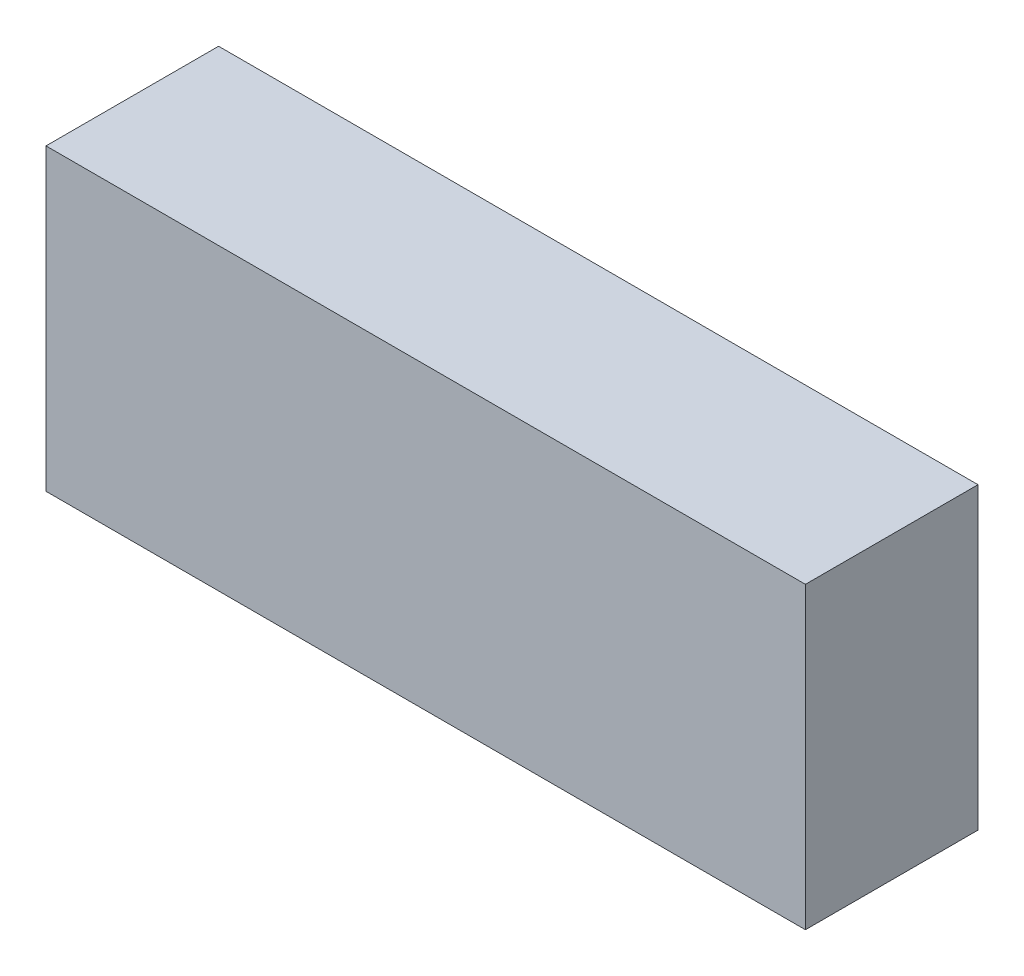
ISO-10303-21;
HEADER;
FILE_DESCRIPTION(('STEP AP214'),'2;1');
FILE_NAME('part.step','',(''),(''),'','','');
FILE_SCHEMA(('AUTOMOTIVE_DESIGN { 1 0 10303 214 1 1 1 1 }'));
ENDSEC;
DATA;
#1=APPLICATION_CONTEXT('core data for automotive mechanical design processes');
#2=APPLICATION_PROTOCOL_DEFINITION('international standard','automotive_design',2000,#1);
#3=PRODUCT_CONTEXT('',#1,'mechanical');
#4=PRODUCT('Part','Part','',(#3));
#5=PRODUCT_RELATED_PRODUCT_CATEGORY('part','',(#4));
#6=PRODUCT_DEFINITION_FORMATION('','',#4);
#7=PRODUCT_DEFINITION_CONTEXT('part definition',#1,'design');
#8=PRODUCT_DEFINITION('design','',#6,#7);
#9=PRODUCT_DEFINITION_SHAPE('','',#8);
#10=(LENGTH_UNIT() NAMED_UNIT(*) SI_UNIT(.MILLI.,.METRE.));
#11=(NAMED_UNIT(*) PLANE_ANGLE_UNIT() SI_UNIT($,.RADIAN.));
#12=(NAMED_UNIT(*) SI_UNIT($,.STERADIAN.) SOLID_ANGLE_UNIT());
#13=UNCERTAINTY_MEASURE_WITH_UNIT(LENGTH_MEASURE(1.E-05),#10,'distance_accuracy_value','');
#14=(GEOMETRIC_REPRESENTATION_CONTEXT(3) GLOBAL_UNCERTAINTY_ASSIGNED_CONTEXT((#13)) GLOBAL_UNIT_ASSIGNED_CONTEXT((#10,
#11,#12)) REPRESENTATION_CONTEXT('',''));
#15=CARTESIAN_POINT('',(0.,0.,0.));
#16=DIRECTION('',(0.,0.,1.));
#17=DIRECTION('',(1.,0.,0.));
#18=AXIS2_PLACEMENT_3D('',#15,#16,#17);
#19=CARTESIAN_POINT('',(-1.65,0.65,0.8));
#20=DIRECTION('',(0.,0.,1.));
#21=DIRECTION('',(1.,0.,0.));
#22=AXIS2_PLACEMENT_3D('',#19,#20,#21);
#23=PLANE('',#22);
#24=DIRECTION('',(0.,1.,0.));
#25=VECTOR('',#24,1.);
#26=CARTESIAN_POINT('',(1.65,0.65,0.8));
#27=LINE('',#26,#25);
#28=CARTESIAN_POINT('',(1.65,0.65,0.8));
#29=VERTEX_POINT('',#28);
#30=CARTESIAN_POINT('',(1.65,-0.65,0.8));
#31=VERTEX_POINT('',#30);
#32=EDGE_CURVE('E52',#29,#31,#27,.F.);
#33=ORIENTED_EDGE('',*,*,#32,.F.);
#34=DIRECTION('',(1.,0.,0.));
#35=VECTOR('',#34,1.);
#36=CARTESIAN_POINT('',(-1.65,0.65,0.8));
#37=LINE('',#36,#35);
#38=CARTESIAN_POINT('',(-1.65,0.65,0.8));
#39=VERTEX_POINT('',#38);
#40=EDGE_CURVE('E67',#39,#29,#37,.T.);
#41=ORIENTED_EDGE('',*,*,#40,.F.);
#42=DIRECTION('',(0.,1.,0.));
#43=VECTOR('',#42,1.);
#44=CARTESIAN_POINT('',(-1.65,-0.65,0.8));
#45=LINE('',#44,#43);
#46=CARTESIAN_POINT('',(-1.65,-0.65,0.8));
#47=VERTEX_POINT('',#46);
#48=EDGE_CURVE('E19',#47,#39,#45,.T.);
#49=ORIENTED_EDGE('',*,*,#48,.F.);
#50=DIRECTION('',(1.,0.,0.));
#51=VECTOR('',#50,1.);
#52=CARTESIAN_POINT('',(1.65,-0.65,0.8));
#53=LINE('',#52,#51);
#54=EDGE_CURVE('E57',#31,#47,#53,.F.);
#55=ORIENTED_EDGE('',*,*,#54,.F.);
#56=EDGE_LOOP('',(#33,#41,#49,#55));
#57=FACE_BOUND('',#56,.T.);
#58=ADVANCED_FACE('F16',(#57),#23,.T.);
#59=CARTESIAN_POINT('',(-1.65,-0.65,0.05));
#60=DIRECTION('',(-1.,0.,0.));
#61=DIRECTION('',(0.,0.,1.));
#62=AXIS2_PLACEMENT_3D('',#59,#60,#61);
#63=PLANE('',#62);
#64=DIRECTION('',(0.,0.,1.));
#65=VECTOR('',#64,1.);
#66=CARTESIAN_POINT('',(-1.65,0.65,0.05));
#67=LINE('',#66,#65);
#68=CARTESIAN_POINT('',(-1.65,0.65,0.05));
#69=VERTEX_POINT('',#68);
#70=EDGE_CURVE('E78',#69,#39,#67,.T.);
#71=ORIENTED_EDGE('',*,*,#70,.F.);
#72=DIRECTION('',(0.,1.,0.));
#73=VECTOR('',#72,1.);
#74=CARTESIAN_POINT('',(-1.65,0.65,0.05));
#75=LINE('',#74,#73);
#76=CARTESIAN_POINT('',(-1.65,-0.65,0.05));
#77=VERTEX_POINT('',#76);
#78=EDGE_CURVE('E73',#69,#77,#75,.F.);
#79=ORIENTED_EDGE('',*,*,#78,.T.);
#80=DIRECTION('',(0.,0.,-1.));
#81=VECTOR('',#80,1.);
#82=CARTESIAN_POINT('',(-1.65,-0.65,0.05));
#83=LINE('',#82,#81);
#84=EDGE_CURVE('E62',#47,#77,#83,.T.);
#85=ORIENTED_EDGE('',*,*,#84,.F.);
#86=ORIENTED_EDGE('',*,*,#48,.T.);
#87=EDGE_LOOP('',(#71,#79,#85,#86));
#88=FACE_BOUND('',#87,.T.);
#89=ADVANCED_FACE('F72',(#88),#63,.T.);
#90=CARTESIAN_POINT('',(1.65,-0.65,0.05));
#91=DIRECTION('',(0.,-1.,0.));
#92=DIRECTION('',(0.,0.,-1.));
#93=AXIS2_PLACEMENT_3D('',#90,#91,#92);
#94=PLANE('',#93);
#95=ORIENTED_EDGE('',*,*,#84,.T.);
#96=DIRECTION('',(1.,0.,0.));
#97=VECTOR('',#96,1.);
#98=CARTESIAN_POINT('',(-1.65,-0.65,0.05));
#99=LINE('',#98,#97);
#100=CARTESIAN_POINT('',(1.65,-0.65,0.05));
#101=VERTEX_POINT('',#100);
#102=EDGE_CURVE('E83',#77,#101,#99,.T.);
#103=ORIENTED_EDGE('',*,*,#102,.T.);
#104=DIRECTION('',(0.,0.,-1.));
#105=VECTOR('',#104,1.);
#106=CARTESIAN_POINT('',(1.65,-0.65,0.05));
#107=LINE('',#106,#105);
#108=EDGE_CURVE('E64',#31,#101,#107,.T.);
#109=ORIENTED_EDGE('',*,*,#108,.F.);
#110=ORIENTED_EDGE('',*,*,#54,.T.);
#111=EDGE_LOOP('',(#95,#103,#109,#110));
#112=FACE_BOUND('',#111,.T.);
#113=ADVANCED_FACE('F59',(#112),#94,.T.);
#114=CARTESIAN_POINT('',(1.65,0.65,0.05));
#115=DIRECTION('',(1.,0.,0.));
#116=DIRECTION('',(0.,0.,-1.));
#117=AXIS2_PLACEMENT_3D('',#114,#115,#116);
#118=PLANE('',#117);
#119=ORIENTED_EDGE('',*,*,#108,.T.);
#120=DIRECTION('',(0.,1.,0.));
#121=VECTOR('',#120,1.);
#122=CARTESIAN_POINT('',(1.65,0.65,0.05));
#123=LINE('',#122,#121);
#124=CARTESIAN_POINT('',(1.65,0.65,0.05));
#125=VERTEX_POINT('',#124);
#126=EDGE_CURVE('E25',#101,#125,#123,.T.);
#127=ORIENTED_EDGE('',*,*,#126,.T.);
#128=DIRECTION('',(0.,0.,1.));
#129=VECTOR('',#128,1.);
#130=CARTESIAN_POINT('',(1.65,0.65,0.05));
#131=LINE('',#130,#129);
#132=EDGE_CURVE('E33',#29,#125,#131,.F.);
#133=ORIENTED_EDGE('',*,*,#132,.F.);
#134=ORIENTED_EDGE('',*,*,#32,.T.);
#135=EDGE_LOOP('',(#119,#127,#133,#134));
#136=FACE_BOUND('',#135,.T.);
#137=ADVANCED_FACE('F87',(#136),#118,.T.);
#138=CARTESIAN_POINT('',(-1.65,0.65,0.05));
#139=DIRECTION('',(0.,1.,0.));
#140=DIRECTION('',(0.,0.,1.));
#141=AXIS2_PLACEMENT_3D('',#138,#139,#140);
#142=PLANE('',#141);
#143=ORIENTED_EDGE('',*,*,#132,.T.);
#144=DIRECTION('',(1.,0.,0.));
#145=VECTOR('',#144,1.);
#146=CARTESIAN_POINT('',(-1.65,0.65,0.05));
#147=LINE('',#146,#145);
#148=EDGE_CURVE('E10',#125,#69,#147,.F.);
#149=ORIENTED_EDGE('',*,*,#148,.T.);
#150=ORIENTED_EDGE('',*,*,#70,.T.);
#151=ORIENTED_EDGE('',*,*,#40,.T.);
#152=EDGE_LOOP('',(#143,#149,#150,#151));
#153=FACE_BOUND('',#152,.T.);
#154=ADVANCED_FACE('F90',(#153),#142,.T.);
#155=CARTESIAN_POINT('',(-1.65,0.65,0.05));
#156=DIRECTION('',(0.,0.,1.));
#157=DIRECTION('',(1.,0.,0.));
#158=AXIS2_PLACEMENT_3D('',#155,#156,#157);
#159=PLANE('',#158);
#160=ORIENTED_EDGE('',*,*,#126,.F.);
#161=ORIENTED_EDGE('',*,*,#102,.F.);
#162=ORIENTED_EDGE('',*,*,#78,.F.);
#163=ORIENTED_EDGE('',*,*,#148,.F.);
#164=EDGE_LOOP('',(#160,#161,#162,#163));
#165=FACE_BOUND('',#164,.T.);
#166=ADVANCED_FACE('F89',(#165),#159,.F.);
#167=CLOSED_SHELL('',(#58,#89,#113,#137,#154,#166));
#168=MANIFOLD_SOLID_BREP('B1',#167);
#169=ADVANCED_BREP_SHAPE_REPRESENTATION('',(#18,#168),#14);
#170=SHAPE_DEFINITION_REPRESENTATION(#9,#169);
ENDSEC;
END-ISO-10303-21;
